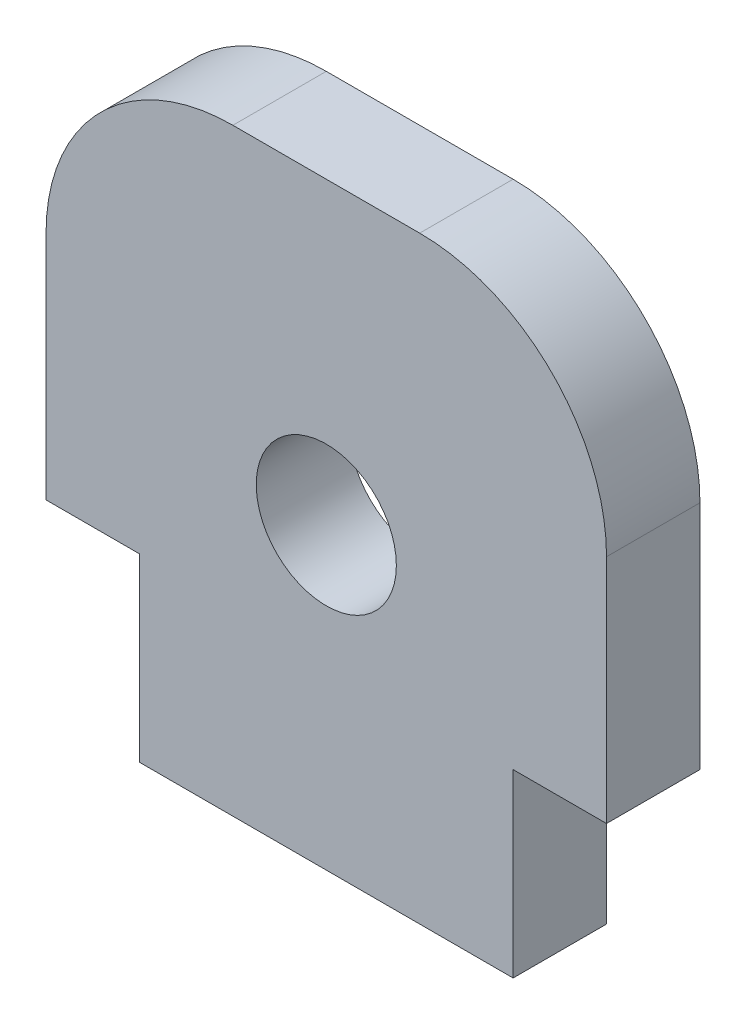
ISO-10303-21;
HEADER;
FILE_DESCRIPTION(('STEP AP214'),'2;1');
FILE_NAME('part.step','',(''),(''),'','','');
FILE_SCHEMA(('AUTOMOTIVE_DESIGN { 1 0 10303 214 1 1 1 1 }'));
ENDSEC;
DATA;
#1=APPLICATION_CONTEXT('core data for automotive mechanical design processes');
#2=APPLICATION_PROTOCOL_DEFINITION('international standard','automotive_design',2000,#1);
#3=PRODUCT_CONTEXT('',#1,'mechanical');
#4=PRODUCT('Part','Part','',(#3));
#5=PRODUCT_RELATED_PRODUCT_CATEGORY('part','',(#4));
#6=PRODUCT_DEFINITION_FORMATION('','',#4);
#7=PRODUCT_DEFINITION_CONTEXT('part definition',#1,'design');
#8=PRODUCT_DEFINITION('design','',#6,#7);
#9=PRODUCT_DEFINITION_SHAPE('','',#8);
#10=(LENGTH_UNIT() NAMED_UNIT(*) SI_UNIT(.MILLI.,.METRE.));
#11=(NAMED_UNIT(*) PLANE_ANGLE_UNIT() SI_UNIT($,.RADIAN.));
#12=(NAMED_UNIT(*) SI_UNIT($,.STERADIAN.) SOLID_ANGLE_UNIT());
#13=UNCERTAINTY_MEASURE_WITH_UNIT(LENGTH_MEASURE(1.E-05),#10,'distance_accuracy_value','');
#14=(GEOMETRIC_REPRESENTATION_CONTEXT(3) GLOBAL_UNCERTAINTY_ASSIGNED_CONTEXT((#13)) GLOBAL_UNIT_ASSIGNED_CONTEXT((#10,
#11,#12)) REPRESENTATION_CONTEXT('',''));
#15=CARTESIAN_POINT('',(0.,0.,0.));
#16=DIRECTION('',(0.,0.,1.));
#17=DIRECTION('',(1.,0.,0.));
#18=AXIS2_PLACEMENT_3D('',#15,#16,#17);
#19=CARTESIAN_POINT('',(9.52499999999994,12.2644763381073,3.175));
#20=DIRECTION('',(0.,0.,-1.));
#21=DIRECTION('',(-1.,0.,0.));
#22=AXIS2_PLACEMENT_3D('',#19,#20,#21);
#23=PLANE('',#22);
#24=CARTESIAN_POINT('',(6.35,8.43700615845026,3.175));
#25=DIRECTION('',(0.,0.,1.));
#26=DIRECTION('',(1.,0.,0.));
#27=AXIS2_PLACEMENT_3D('',#24,#25,#26);
#28=CIRCLE('',#27,2.38125);
#29=CARTESIAN_POINT('',(8.73125,8.43700615845026,3.175));
#30=VERTEX_POINT('',#29);
#31=EDGE_CURVE('E142',#30,#30,#28,.T.);
#32=ORIENTED_EDGE('',*,*,#31,.F.);
#33=EDGE_LOOP('',(#32));
#34=FACE_BOUND('',#33,.T.);
#35=DIRECTION('',(-1.,0.,0.));
#36=VECTOR('',#35,1.);
#37=CARTESIAN_POINT('',(0.,4.41162798120273,3.175));
#38=LINE('',#37,#36);
#39=CARTESIAN_POINT('',(0.,4.41162798120273,3.175));
#40=VERTEX_POINT('',#39);
#41=CARTESIAN_POINT('',(-3.175,4.41162798120273,3.175));
#42=VERTEX_POINT('',#41);
#43=EDGE_CURVE('E112',#40,#42,#38,.T.);
#44=ORIENTED_EDGE('',*,*,#43,.F.);
#45=DIRECTION('',(0.,-1.,0.));
#46=VECTOR('',#45,1.);
#47=CARTESIAN_POINT('',(0.,-1.72299384154974,3.175));
#48=LINE('',#47,#46);
#49=CARTESIAN_POINT('',(0.,-1.72299384154974,3.175));
#50=VERTEX_POINT('',#49);
#51=EDGE_CURVE('E103',#40,#50,#48,.T.);
#52=ORIENTED_EDGE('',*,*,#51,.T.);
#53=DIRECTION('',(1.,0.,0.));
#54=VECTOR('',#53,1.);
#55=CARTESIAN_POINT('',(0.,-1.72299384154974,3.175));
#56=LINE('',#55,#54);
#57=CARTESIAN_POINT('',(12.7,-1.72299384154974,3.175));
#58=VERTEX_POINT('',#57);
#59=EDGE_CURVE('E107',#50,#58,#56,.T.);
#60=ORIENTED_EDGE('',*,*,#59,.T.);
#61=DIRECTION('',(0.,1.,0.));
#62=VECTOR('',#61,1.);
#63=CARTESIAN_POINT('',(12.7,-1.72299384154974,3.175));
#64=LINE('',#63,#62);
#65=CARTESIAN_POINT('',(12.7,4.41162798120268,3.17499999999998));
#66=VERTEX_POINT('',#65);
#67=EDGE_CURVE('E131',#58,#66,#64,.T.);
#68=ORIENTED_EDGE('',*,*,#67,.T.);
#69=DIRECTION('',(-1.,0.,0.));
#70=VECTOR('',#69,1.);
#71=CARTESIAN_POINT('',(15.875,4.41162798120268,3.17499999999998));
#72=LINE('',#71,#70);
#73=CARTESIAN_POINT('',(15.875,4.41162798120268,3.17499999999998));
#74=VERTEX_POINT('',#73);
#75=EDGE_CURVE('E196',#74,#66,#72,.T.);
#76=ORIENTED_EDGE('',*,*,#75,.F.);
#77=DIRECTION('',(0.,1.,0.));
#78=VECTOR('',#77,1.);
#79=CARTESIAN_POINT('',(15.875,3.17500000000006,3.175));
#80=LINE('',#79,#78);
#81=CARTESIAN_POINT('',(15.8749999999999,12.2644763381073,3.175));
#82=VERTEX_POINT('',#81);
#83=EDGE_CURVE('E57',#74,#82,#80,.T.);
#84=ORIENTED_EDGE('',*,*,#83,.T.);
#85=CARTESIAN_POINT('',(9.52499999999994,12.2644763381073,3.175));
#86=DIRECTION('',(0.,0.,1.));
#87=DIRECTION('',(-1.,0.,0.));
#88=AXIS2_PLACEMENT_3D('',#85,#86,#87);
#89=CIRCLE('',#88,6.35);
#90=CARTESIAN_POINT('',(9.52499999999994,18.6144763381073,3.175));
#91=VERTEX_POINT('',#90);
#92=EDGE_CURVE('E156',#82,#91,#89,.T.);
#93=ORIENTED_EDGE('',*,*,#92,.T.);
#94=DIRECTION('',(-1.,0.,0.));
#95=VECTOR('',#94,1.);
#96=CARTESIAN_POINT('',(3.175,18.6144763381073,3.175));
#97=LINE('',#96,#95);
#98=CARTESIAN_POINT('',(3.175,18.6144763381073,3.175));
#99=VERTEX_POINT('',#98);
#100=EDGE_CURVE('E92',#91,#99,#97,.T.);
#101=ORIENTED_EDGE('',*,*,#100,.T.);
#102=CARTESIAN_POINT('',(3.175,12.2644763381073,3.175));
#103=DIRECTION('',(0.,0.,1.));
#104=DIRECTION('',(-1.,0.,0.));
#105=AXIS2_PLACEMENT_3D('',#102,#103,#104);
#106=CIRCLE('',#105,6.35);
#107=CARTESIAN_POINT('',(-3.175,12.2644763381073,3.175));
#108=VERTEX_POINT('',#107);
#109=EDGE_CURVE('E166',#99,#108,#106,.T.);
#110=ORIENTED_EDGE('',*,*,#109,.T.);
#111=DIRECTION('',(0.,-1.,0.));
#112=VECTOR('',#111,1.);
#113=CARTESIAN_POINT('',(-3.175,3.17500000000006,3.175));
#114=LINE('',#113,#112);
#115=EDGE_CURVE('E116',#108,#42,#114,.T.);
#116=ORIENTED_EDGE('',*,*,#115,.T.);
#117=EDGE_LOOP('',(#44,#52,#60,#68,#76,#84,#93,#101,#110,#116));
#118=FACE_BOUND('',#117,.T.);
#119=ADVANCED_FACE('F33',(#34,#118),#23,.F.);
#120=CARTESIAN_POINT('',(9.52499999999994,12.2644763381073,0.));
#121=DIRECTION('',(0.,0.,-1.));
#122=DIRECTION('',(-1.,0.,0.));
#123=AXIS2_PLACEMENT_3D('',#120,#121,#122);
#124=PLANE('',#123);
#125=DIRECTION('',(0.,-1.,0.));
#126=VECTOR('',#125,1.);
#127=CARTESIAN_POINT('',(0.,-1.72299384154974,0.));
#128=LINE('',#127,#126);
#129=CARTESIAN_POINT('',(0.,4.41162798120273,0.));
#130=VERTEX_POINT('',#129);
#131=CARTESIAN_POINT('',(0.,-1.72299384154974,0.));
#132=VERTEX_POINT('',#131);
#133=EDGE_CURVE('E122',#130,#132,#128,.T.);
#134=ORIENTED_EDGE('',*,*,#133,.F.);
#135=DIRECTION('',(-1.,0.,0.));
#136=VECTOR('',#135,1.);
#137=CARTESIAN_POINT('',(0.,4.41162798120273,0.));
#138=LINE('',#137,#136);
#139=CARTESIAN_POINT('',(-3.175,4.41162798120273,0.));
#140=VERTEX_POINT('',#139);
#141=EDGE_CURVE('E175',#130,#140,#138,.T.);
#142=ORIENTED_EDGE('',*,*,#141,.T.);
#143=DIRECTION('',(0.,-1.,0.));
#144=VECTOR('',#143,1.);
#145=CARTESIAN_POINT('',(-3.175,3.17500000000006,0.));
#146=LINE('',#145,#144);
#147=CARTESIAN_POINT('',(-3.175,12.2644763381073,0.));
#148=VERTEX_POINT('',#147);
#149=EDGE_CURVE('E146',#148,#140,#146,.T.);
#150=ORIENTED_EDGE('',*,*,#149,.F.);
#151=CARTESIAN_POINT('',(3.175,12.2644763381073,0.));
#152=DIRECTION('',(0.,0.,1.));
#153=DIRECTION('',(-1.,0.,0.));
#154=AXIS2_PLACEMENT_3D('',#151,#152,#153);
#155=CIRCLE('',#154,6.35);
#156=CARTESIAN_POINT('',(3.175,18.6144763381073,0.));
#157=VERTEX_POINT('',#156);
#158=EDGE_CURVE('E144',#157,#148,#155,.T.);
#159=ORIENTED_EDGE('',*,*,#158,.F.);
#160=DIRECTION('',(-1.,0.,0.));
#161=VECTOR('',#160,1.);
#162=CARTESIAN_POINT('',(3.175,18.6144763381073,0.));
#163=LINE('',#162,#161);
#164=CARTESIAN_POINT('',(9.52499999999994,18.6144763381073,0.));
#165=VERTEX_POINT('',#164);
#166=EDGE_CURVE('E141',#165,#157,#163,.T.);
#167=ORIENTED_EDGE('',*,*,#166,.F.);
#168=CARTESIAN_POINT('',(9.52499999999994,12.2644763381073,0.));
#169=DIRECTION('',(0.,0.,1.));
#170=DIRECTION('',(-1.,0.,0.));
#171=AXIS2_PLACEMENT_3D('',#168,#169,#170);
#172=CIRCLE('',#171,6.35);
#173=CARTESIAN_POINT('',(15.8749999999999,12.2644763381073,0.));
#174=VERTEX_POINT('',#173);
#175=EDGE_CURVE('E138',#174,#165,#172,.T.);
#176=ORIENTED_EDGE('',*,*,#175,.F.);
#177=DIRECTION('',(0.,1.,0.));
#178=VECTOR('',#177,1.);
#179=CARTESIAN_POINT('',(15.875,3.17500000000006,0.));
#180=LINE('',#179,#178);
#181=CARTESIAN_POINT('',(15.875,4.41162798120268,0.));
#182=VERTEX_POINT('',#181);
#183=EDGE_CURVE('E84',#182,#174,#180,.T.);
#184=ORIENTED_EDGE('',*,*,#183,.F.);
#185=DIRECTION('',(-1.,0.,0.));
#186=VECTOR('',#185,1.);
#187=CARTESIAN_POINT('',(15.875,4.41162798120268,0.));
#188=LINE('',#187,#186);
#189=CARTESIAN_POINT('',(12.7,4.41162798120268,0.));
#190=VERTEX_POINT('',#189);
#191=EDGE_CURVE('E48',#182,#190,#188,.T.);
#192=ORIENTED_EDGE('',*,*,#191,.T.);
#193=DIRECTION('',(0.,1.,0.));
#194=VECTOR('',#193,1.);
#195=CARTESIAN_POINT('',(12.7,-1.72299384154974,0.));
#196=LINE('',#195,#194);
#197=CARTESIAN_POINT('',(12.7,-1.72299384154974,0.));
#198=VERTEX_POINT('',#197);
#199=EDGE_CURVE('E152',#198,#190,#196,.T.);
#200=ORIENTED_EDGE('',*,*,#199,.F.);
#201=DIRECTION('',(1.,0.,0.));
#202=VECTOR('',#201,1.);
#203=CARTESIAN_POINT('',(0.,-1.72299384154974,0.));
#204=LINE('',#203,#202);
#205=EDGE_CURVE('E150',#132,#198,#204,.T.);
#206=ORIENTED_EDGE('',*,*,#205,.F.);
#207=EDGE_LOOP('',(#134,#142,#150,#159,#167,#176,#184,#192,#200,#206));
#208=FACE_BOUND('',#207,.T.);
#209=CARTESIAN_POINT('',(6.35,8.43700615845026,0.));
#210=DIRECTION('',(0.,0.,1.));
#211=DIRECTION('',(1.,0.,0.));
#212=AXIS2_PLACEMENT_3D('',#209,#210,#211);
#213=CIRCLE('',#212,2.38125);
#214=CARTESIAN_POINT('',(8.73125,8.43700615845026,0.));
#215=VERTEX_POINT('',#214);
#216=EDGE_CURVE('E199',#215,#215,#213,.T.);
#217=ORIENTED_EDGE('',*,*,#216,.T.);
#218=EDGE_LOOP('',(#217));
#219=FACE_BOUND('',#218,.T.);
#220=ADVANCED_FACE('F169',(#208,#219),#124,.T.);
#221=CARTESIAN_POINT('',(9.52499999999994,12.2644763381073,3.175));
#222=DIRECTION('',(0.,0.,-1.));
#223=DIRECTION('',(-1.,0.,0.));
#224=AXIS2_PLACEMENT_3D('',#221,#222,#223);
#225=CYLINDRICAL_SURFACE('',#224,6.35);
#226=ORIENTED_EDGE('',*,*,#175,.T.);
#227=DIRECTION('',(0.,0.,-1.));
#228=VECTOR('',#227,1.);
#229=CARTESIAN_POINT('',(9.52499999999994,18.6144763381073,3.175));
#230=LINE('',#229,#228);
#231=EDGE_CURVE('E11',#91,#165,#230,.T.);
#232=ORIENTED_EDGE('',*,*,#231,.F.);
#233=ORIENTED_EDGE('',*,*,#92,.F.);
#234=DIRECTION('',(0.,0.,-1.));
#235=VECTOR('',#234,1.);
#236=CARTESIAN_POINT('',(15.8749999999999,12.2644763381073,3.175));
#237=LINE('',#236,#235);
#238=EDGE_CURVE('E137',#82,#174,#237,.T.);
#239=ORIENTED_EDGE('',*,*,#238,.T.);
#240=EDGE_LOOP('',(#226,#232,#233,#239));
#241=FACE_BOUND('',#240,.T.);
#242=ADVANCED_FACE('F35',(#241),#225,.T.);
#243=CARTESIAN_POINT('',(3.175,18.6144763381073,3.175));
#244=DIRECTION('',(0.,-1.,0.));
#245=DIRECTION('',(0.,0.,-1.));
#246=AXIS2_PLACEMENT_3D('',#243,#244,#245);
#247=PLANE('',#246);
#248=ORIENTED_EDGE('',*,*,#166,.T.);
#249=DIRECTION('',(0.,0.,-1.));
#250=VECTOR('',#249,1.);
#251=CARTESIAN_POINT('',(3.175,18.6144763381073,3.175));
#252=LINE('',#251,#250);
#253=EDGE_CURVE('E41',#99,#157,#252,.T.);
#254=ORIENTED_EDGE('',*,*,#253,.F.);
#255=ORIENTED_EDGE('',*,*,#100,.F.);
#256=ORIENTED_EDGE('',*,*,#231,.T.);
#257=EDGE_LOOP('',(#248,#254,#255,#256));
#258=FACE_BOUND('',#257,.T.);
#259=ADVANCED_FACE('F330',(#258),#247,.F.);
#260=CARTESIAN_POINT('',(3.175,12.2644763381073,3.175));
#261=DIRECTION('',(0.,0.,-1.));
#262=DIRECTION('',(-1.,0.,0.));
#263=AXIS2_PLACEMENT_3D('',#260,#261,#262);
#264=CYLINDRICAL_SURFACE('',#263,6.35);
#265=ORIENTED_EDGE('',*,*,#158,.T.);
#266=DIRECTION('',(0.,0.,-1.));
#267=VECTOR('',#266,1.);
#268=CARTESIAN_POINT('',(-3.175,12.2644763381073,3.175));
#269=LINE('',#268,#267);
#270=EDGE_CURVE('E125',#108,#148,#269,.T.);
#271=ORIENTED_EDGE('',*,*,#270,.F.);
#272=ORIENTED_EDGE('',*,*,#109,.F.);
#273=ORIENTED_EDGE('',*,*,#253,.T.);
#274=EDGE_LOOP('',(#265,#271,#272,#273));
#275=FACE_BOUND('',#274,.T.);
#276=ADVANCED_FACE('F164',(#275),#264,.T.);
#277=CARTESIAN_POINT('',(-3.175,3.17500000000006,3.175));
#278=DIRECTION('',(1.,0.,0.));
#279=DIRECTION('',(0.,0.,-1.));
#280=AXIS2_PLACEMENT_3D('',#277,#278,#279);
#281=PLANE('',#280);
#282=ORIENTED_EDGE('',*,*,#149,.T.);
#283=DIRECTION('',(0.,0.,-1.));
#284=VECTOR('',#283,1.);
#285=CARTESIAN_POINT('',(-3.175,4.41162798120273,-19.0431255395319));
#286=LINE('',#285,#284);
#287=EDGE_CURVE('E182',#42,#140,#286,.T.);
#288=ORIENTED_EDGE('',*,*,#287,.F.);
#289=ORIENTED_EDGE('',*,*,#115,.F.);
#290=ORIENTED_EDGE('',*,*,#270,.T.);
#291=EDGE_LOOP('',(#282,#288,#289,#290));
#292=FACE_BOUND('',#291,.T.);
#293=ADVANCED_FACE('F179',(#292),#281,.F.);
#294=CARTESIAN_POINT('',(0.,-1.72299384154974,3.175));
#295=DIRECTION('',(1.,0.,0.));
#296=DIRECTION('',(0.,1.,0.));
#297=AXIS2_PLACEMENT_3D('',#294,#295,#296);
#298=PLANE('',#297);
#299=ORIENTED_EDGE('',*,*,#133,.T.);
#300=DIRECTION('',(0.,0.,-1.));
#301=VECTOR('',#300,1.);
#302=CARTESIAN_POINT('',(0.,-1.72299384154974,3.175));
#303=LINE('',#302,#301);
#304=EDGE_CURVE('E119',#50,#132,#303,.T.);
#305=ORIENTED_EDGE('',*,*,#304,.F.);
#306=ORIENTED_EDGE('',*,*,#51,.F.);
#307=DIRECTION('',(0.,0.,-1.));
#308=VECTOR('',#307,1.);
#309=CARTESIAN_POINT('',(0.,4.41162798120273,-19.0431255395319));
#310=LINE('',#309,#308);
#311=EDGE_CURVE('E187',#40,#130,#310,.T.);
#312=ORIENTED_EDGE('',*,*,#311,.T.);
#313=EDGE_LOOP('',(#299,#305,#306,#312));
#314=FACE_BOUND('',#313,.T.);
#315=ADVANCED_FACE('F120',(#314),#298,.F.);
#316=CARTESIAN_POINT('',(0.,-1.72299384154974,3.175));
#317=DIRECTION('',(0.,1.,0.));
#318=DIRECTION('',(0.,0.,1.));
#319=AXIS2_PLACEMENT_3D('',#316,#317,#318);
#320=PLANE('',#319);
#321=ORIENTED_EDGE('',*,*,#205,.T.);
#322=DIRECTION('',(0.,0.,-1.));
#323=VECTOR('',#322,1.);
#324=CARTESIAN_POINT('',(12.7,-1.72299384154974,3.175));
#325=LINE('',#324,#323);
#326=EDGE_CURVE('E126',#58,#198,#325,.T.);
#327=ORIENTED_EDGE('',*,*,#326,.F.);
#328=ORIENTED_EDGE('',*,*,#59,.F.);
#329=ORIENTED_EDGE('',*,*,#304,.T.);
#330=EDGE_LOOP('',(#321,#327,#328,#329));
#331=FACE_BOUND('',#330,.T.);
#332=ADVANCED_FACE('F128',(#331),#320,.F.);
#333=CARTESIAN_POINT('',(12.7,-1.72299384154974,3.175));
#334=DIRECTION('',(-1.,0.,0.));
#335=DIRECTION('',(0.,0.,1.));
#336=AXIS2_PLACEMENT_3D('',#333,#334,#335);
#337=PLANE('',#336);
#338=ORIENTED_EDGE('',*,*,#199,.T.);
#339=DIRECTION('',(0.,0.,-1.));
#340=VECTOR('',#339,1.);
#341=CARTESIAN_POINT('',(12.7,4.41162798120269,-19.0431255395319));
#342=LINE('',#341,#340);
#343=EDGE_CURVE('E192',#66,#190,#342,.T.);
#344=ORIENTED_EDGE('',*,*,#343,.F.);
#345=ORIENTED_EDGE('',*,*,#67,.F.);
#346=ORIENTED_EDGE('',*,*,#326,.T.);
#347=EDGE_LOOP('',(#338,#344,#345,#346));
#348=FACE_BOUND('',#347,.T.);
#349=ADVANCED_FACE('F215',(#348),#337,.F.);
#350=CARTESIAN_POINT('',(15.875,3.17500000000006,3.175));
#351=DIRECTION('',(-1.,0.,0.));
#352=DIRECTION('',(0.,-1.,0.));
#353=AXIS2_PLACEMENT_3D('',#350,#351,#352);
#354=PLANE('',#353);
#355=ORIENTED_EDGE('',*,*,#83,.F.);
#356=DIRECTION('',(0.,0.,-1.));
#357=VECTOR('',#356,1.);
#358=CARTESIAN_POINT('',(15.875,4.41162798120269,-19.0431255395319));
#359=LINE('',#358,#357);
#360=EDGE_CURVE('E194',#74,#182,#359,.T.);
#361=ORIENTED_EDGE('',*,*,#360,.T.);
#362=ORIENTED_EDGE('',*,*,#183,.T.);
#363=ORIENTED_EDGE('',*,*,#238,.F.);
#364=EDGE_LOOP('',(#355,#361,#362,#363));
#365=FACE_BOUND('',#364,.T.);
#366=ADVANCED_FACE('F221',(#365),#354,.F.);
#367=CARTESIAN_POINT('',(6.35,8.43700615845026,3.175));
#368=DIRECTION('',(0.,0.,-1.));
#369=DIRECTION('',(-1.,0.,0.));
#370=AXIS2_PLACEMENT_3D('',#367,#368,#369);
#371=CYLINDRICAL_SURFACE('',#370,2.38125);
#372=ORIENTED_EDGE('',*,*,#31,.T.);
#373=EDGE_LOOP('',(#372));
#374=FACE_BOUND('',#373,.T.);
#375=ORIENTED_EDGE('',*,*,#216,.F.);
#376=EDGE_LOOP('',(#375));
#377=FACE_BOUND('',#376,.T.);
#378=ADVANCED_FACE('F223',(#374,#377),#371,.F.);
#379=CARTESIAN_POINT('',(15.875,4.41162798120269,-19.0431255395319));
#380=DIRECTION('',(0.,1.,0.));
#381=DIRECTION('',(-1.,0.,0.));
#382=AXIS2_PLACEMENT_3D('',#379,#380,#381);
#383=PLANE('',#382);
#384=ORIENTED_EDGE('',*,*,#343,.T.);
#385=ORIENTED_EDGE('',*,*,#191,.F.);
#386=ORIENTED_EDGE('',*,*,#360,.F.);
#387=ORIENTED_EDGE('',*,*,#75,.T.);
#388=EDGE_LOOP('',(#384,#385,#386,#387));
#389=FACE_BOUND('',#388,.T.);
#390=ADVANCED_FACE('F217',(#389),#383,.F.);
#391=CARTESIAN_POINT('',(0.,4.41162798120273,-19.0431255395319));
#392=DIRECTION('',(0.,1.,0.));
#393=DIRECTION('',(-1.,0.,0.));
#394=AXIS2_PLACEMENT_3D('',#391,#392,#393);
#395=PLANE('',#394);
#396=ORIENTED_EDGE('',*,*,#287,.T.);
#397=ORIENTED_EDGE('',*,*,#141,.F.);
#398=ORIENTED_EDGE('',*,*,#311,.F.);
#399=ORIENTED_EDGE('',*,*,#43,.T.);
#400=EDGE_LOOP('',(#396,#397,#398,#399));
#401=FACE_BOUND('',#400,.T.);
#402=ADVANCED_FACE('F185',(#401),#395,.F.);
#403=CLOSED_SHELL('',(#119,#220,#242,#259,#276,#293,#315,#332,#349,#366,#378,#390,#402));
#404=MANIFOLD_SOLID_BREP('B2',#403);
#405=ADVANCED_BREP_SHAPE_REPRESENTATION('',(#18,#404),#14);
#406=SHAPE_DEFINITION_REPRESENTATION(#9,#405);
ENDSEC;
END-ISO-10303-21;
